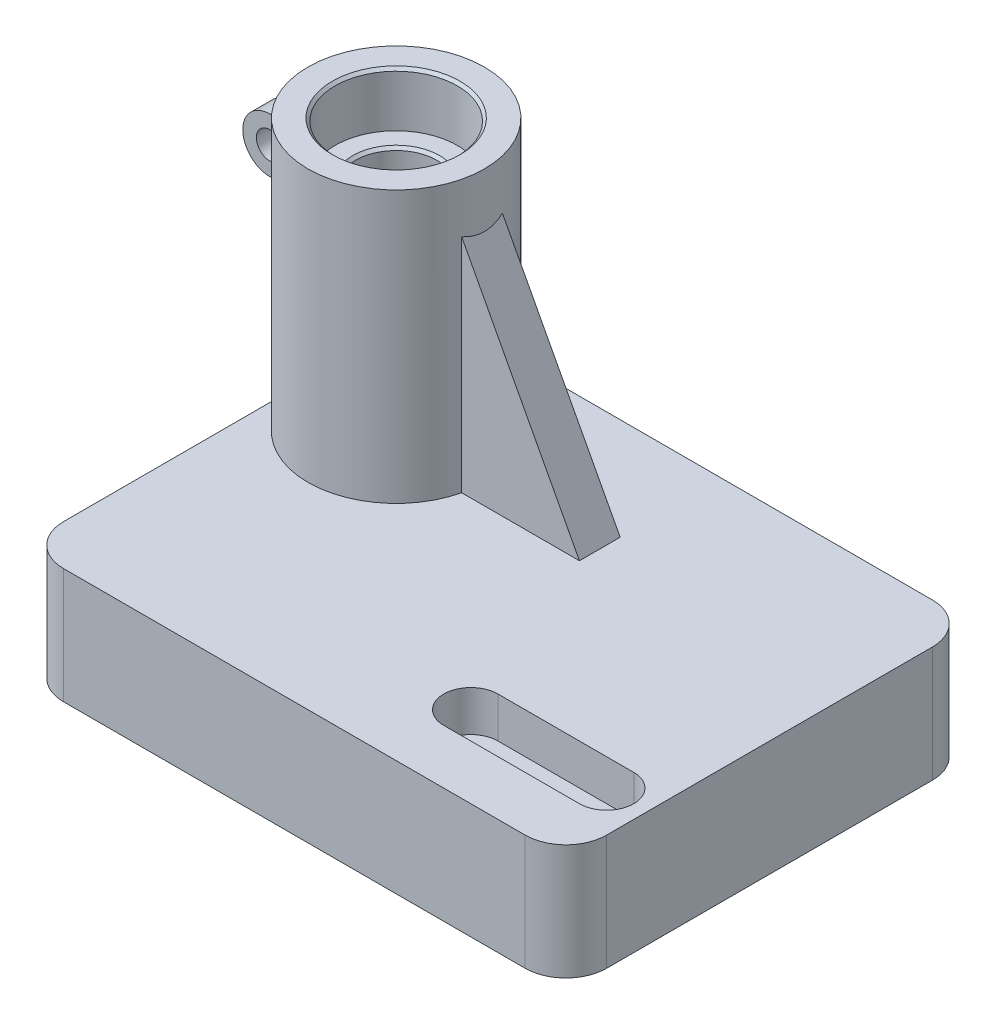
ISO-10303-21;
HEADER;
FILE_DESCRIPTION(('STEP AP214'),'2;1');
FILE_NAME('part.step','',(''),(''),'','','');
FILE_SCHEMA(('AUTOMOTIVE_DESIGN { 1 0 10303 214 1 1 1 1 }'));
ENDSEC;
DATA;
#1=APPLICATION_CONTEXT('core data for automotive mechanical design processes');
#2=APPLICATION_PROTOCOL_DEFINITION('international standard','automotive_design',2000,#1);
#3=PRODUCT_CONTEXT('',#1,'mechanical');
#4=PRODUCT('Part','Part','',(#3));
#5=PRODUCT_RELATED_PRODUCT_CATEGORY('part','',(#4));
#6=PRODUCT_DEFINITION_FORMATION('','',#4);
#7=PRODUCT_DEFINITION_CONTEXT('part definition',#1,'design');
#8=PRODUCT_DEFINITION('design','',#6,#7);
#9=PRODUCT_DEFINITION_SHAPE('','',#8);
#10=(LENGTH_UNIT() NAMED_UNIT(*) SI_UNIT(.MILLI.,.METRE.));
#11=(NAMED_UNIT(*) PLANE_ANGLE_UNIT() SI_UNIT($,.RADIAN.));
#12=(NAMED_UNIT(*) SI_UNIT($,.STERADIAN.) SOLID_ANGLE_UNIT());
#13=UNCERTAINTY_MEASURE_WITH_UNIT(LENGTH_MEASURE(1.E-05),#10,'distance_accuracy_value','');
#14=(GEOMETRIC_REPRESENTATION_CONTEXT(3) GLOBAL_UNCERTAINTY_ASSIGNED_CONTEXT((#13)) GLOBAL_UNIT_ASSIGNED_CONTEXT((#10,
#11,#12)) REPRESENTATION_CONTEXT('',''));
#15=CARTESIAN_POINT('',(0.,0.,0.));
#16=DIRECTION('',(0.,0.,1.));
#17=DIRECTION('',(1.,0.,0.));
#18=AXIS2_PLACEMENT_3D('',#15,#16,#17);
#19=CARTESIAN_POINT('',(-135.,0.,-60.));
#20=DIRECTION('',(0.,1.,0.));
#21=DIRECTION('',(0.,0.,1.));
#22=AXIS2_PLACEMENT_3D('',#19,#20,#21);
#23=CYLINDRICAL_SURFACE('',#22,30.);
#24=CARTESIAN_POINT('',(-135.,42.,-60.));
#25=DIRECTION('',(0.,1.,0.));
#26=DIRECTION('',(0.,0.,1.));
#27=AXIS2_PLACEMENT_3D('',#24,#25,#26);
#28=CIRCLE('',#27,30.);
#29=CARTESIAN_POINT('',(-135.,42.,-30.));
#30=VERTEX_POINT('',#29);
#31=EDGE_CURVE('E345',#30,#30,#28,.F.);
#32=ORIENTED_EDGE('',*,*,#31,.T.);
#33=EDGE_LOOP('',(#32));
#34=FACE_BOUND('',#33,.T.);
#35=CARTESIAN_POINT('',(-135.,243.,-60.));
#36=DIRECTION('',(0.,1.,0.));
#37=DIRECTION('',(0.,0.,1.));
#38=AXIS2_PLACEMENT_3D('',#35,#36,#37);
#39=CIRCLE('',#38,30.);
#40=CARTESIAN_POINT('',(-135.,243.,-30.));
#41=VERTEX_POINT('',#40);
#42=EDGE_CURVE('E342',#41,#41,#39,.T.);
#43=ORIENTED_EDGE('',*,*,#42,.T.);
#44=EDGE_LOOP('',(#43));
#45=FACE_BOUND('',#44,.T.);
#46=ADVANCED_FACE('F39',(#34,#45),#23,.F.);
#47=CARTESIAN_POINT('',(200.,85.,-150.));
#48=DIRECTION('',(-1.,0.,0.));
#49=DIRECTION('',(0.,0.,1.));
#50=AXIS2_PLACEMENT_3D('',#47,#48,#49);
#51=PLANE('',#50);
#52=DIRECTION('',(0.,0.,-1.));
#53=VECTOR('',#52,1.);
#54=CARTESIAN_POINT('',(200.,0.,-150.));
#55=LINE('',#54,#53);
#56=CARTESIAN_POINT('',(200.,0.,120.));
#57=VERTEX_POINT('',#56);
#58=CARTESIAN_POINT('',(200.,0.,-120.));
#59=VERTEX_POINT('',#58);
#60=EDGE_CURVE('E273',#57,#59,#55,.T.);
#61=ORIENTED_EDGE('',*,*,#60,.T.);
#62=DIRECTION('',(0.,-1.,0.));
#63=VECTOR('',#62,1.);
#64=CARTESIAN_POINT('',(200.,85.,-120.));
#65=LINE('',#64,#63);
#66=CARTESIAN_POINT('',(200.,85.,-120.));
#67=VERTEX_POINT('',#66);
#68=EDGE_CURVE('E329',#59,#67,#65,.F.);
#69=ORIENTED_EDGE('',*,*,#68,.T.);
#70=DIRECTION('',(0.,0.,-1.));
#71=VECTOR('',#70,1.);
#72=CARTESIAN_POINT('',(200.,85.,-150.));
#73=LINE('',#72,#71);
#74=CARTESIAN_POINT('',(200.,85.,120.));
#75=VERTEX_POINT('',#74);
#76=EDGE_CURVE('E276',#75,#67,#73,.T.);
#77=ORIENTED_EDGE('',*,*,#76,.F.);
#78=DIRECTION('',(0.,-1.,0.));
#79=VECTOR('',#78,1.);
#80=CARTESIAN_POINT('',(200.,85.,120.));
#81=LINE('',#80,#79);
#82=EDGE_CURVE('E326',#75,#57,#81,.T.);
#83=ORIENTED_EDGE('',*,*,#82,.T.);
#84=EDGE_LOOP('',(#61,#69,#77,#83));
#85=FACE_BOUND('',#84,.T.);
#86=ADVANCED_FACE('F394',(#85),#51,.F.);
#87=CARTESIAN_POINT('',(-200.,85.,-150.));
#88=DIRECTION('',(0.,0.,1.));
#89=DIRECTION('',(1.,0.,0.));
#90=AXIS2_PLACEMENT_3D('',#87,#88,#89);
#91=PLANE('',#90);
#92=DIRECTION('',(-1.,0.,0.));
#93=VECTOR('',#92,1.);
#94=CARTESIAN_POINT('',(-200.,0.,-150.));
#95=LINE('',#94,#93);
#96=CARTESIAN_POINT('',(170.,0.,-150.));
#97=VERTEX_POINT('',#96);
#98=CARTESIAN_POINT('',(-170.,0.,-150.));
#99=VERTEX_POINT('',#98);
#100=EDGE_CURVE('E292',#97,#99,#95,.T.);
#101=ORIENTED_EDGE('',*,*,#100,.T.);
#102=DIRECTION('',(0.,-1.,0.));
#103=VECTOR('',#102,1.);
#104=CARTESIAN_POINT('',(-170.,85.,-150.));
#105=LINE('',#104,#103);
#106=CARTESIAN_POINT('',(-170.,85.,-150.));
#107=VERTEX_POINT('',#106);
#108=EDGE_CURVE('E316',#99,#107,#105,.F.);
#109=ORIENTED_EDGE('',*,*,#108,.T.);
#110=DIRECTION('',(-1.,0.,0.));
#111=VECTOR('',#110,1.);
#112=CARTESIAN_POINT('',(-200.,85.,-150.));
#113=LINE('',#112,#111);
#114=CARTESIAN_POINT('',(170.,85.,-150.));
#115=VERTEX_POINT('',#114);
#116=EDGE_CURVE('E279',#115,#107,#113,.T.);
#117=ORIENTED_EDGE('',*,*,#116,.F.);
#118=DIRECTION('',(0.,-1.,0.));
#119=VECTOR('',#118,1.);
#120=CARTESIAN_POINT('',(170.,85.,-150.));
#121=LINE('',#120,#119);
#122=EDGE_CURVE('E313',#115,#97,#121,.T.);
#123=ORIENTED_EDGE('',*,*,#122,.T.);
#124=EDGE_LOOP('',(#101,#109,#117,#123));
#125=FACE_BOUND('',#124,.T.);
#126=ADVANCED_FACE('F402',(#125),#91,.F.);
#127=CARTESIAN_POINT('',(-200.,85.,-150.));
#128=DIRECTION('',(1.,0.,0.));
#129=DIRECTION('',(0.,0.,-1.));
#130=AXIS2_PLACEMENT_3D('',#127,#128,#129);
#131=PLANE('',#130);
#132=DIRECTION('',(0.,-1.,0.));
#133=VECTOR('',#132,1.);
#134=CARTESIAN_POINT('',(-200.,85.,120.));
#135=LINE('',#134,#133);
#136=CARTESIAN_POINT('',(-200.,0.,120.));
#137=VERTEX_POINT('',#136);
#138=CARTESIAN_POINT('',(-200.,85.,120.));
#139=VERTEX_POINT('',#138);
#140=EDGE_CURVE('E289',#137,#139,#135,.F.);
#141=ORIENTED_EDGE('',*,*,#140,.T.);
#142=DIRECTION('',(0.,0.,1.));
#143=VECTOR('',#142,1.);
#144=CARTESIAN_POINT('',(-200.,85.,-150.));
#145=LINE('',#144,#143);
#146=CARTESIAN_POINT('',(-200.,85.,-60.));
#147=VERTEX_POINT('',#146);
#148=EDGE_CURVE('E283',#147,#139,#145,.T.);
#149=ORIENTED_EDGE('',*,*,#148,.F.);
#150=CARTESIAN_POINT('',(-200.,85.,-120.));
#151=VERTEX_POINT('',#150);
#152=EDGE_CURVE('E284',#151,#147,#145,.T.);
#153=ORIENTED_EDGE('',*,*,#152,.F.);
#154=DIRECTION('',(0.,-1.,0.));
#155=VECTOR('',#154,1.);
#156=CARTESIAN_POINT('',(-200.,85.,-120.));
#157=LINE('',#156,#155);
#158=CARTESIAN_POINT('',(-200.,0.,-120.));
#159=VERTEX_POINT('',#158);
#160=EDGE_CURVE('E301',#151,#159,#157,.T.);
#161=ORIENTED_EDGE('',*,*,#160,.T.);
#162=DIRECTION('',(0.,0.,1.));
#163=VECTOR('',#162,1.);
#164=CARTESIAN_POINT('',(-200.,0.,-150.));
#165=LINE('',#164,#163);
#166=EDGE_CURVE('E295',#159,#137,#165,.T.);
#167=ORIENTED_EDGE('',*,*,#166,.T.);
#168=EDGE_LOOP('',(#141,#149,#153,#161,#167));
#169=FACE_BOUND('',#168,.T.);
#170=ADVANCED_FACE('F461',(#169),#131,.F.);
#171=CARTESIAN_POINT('',(-200.,85.,150.));
#172=DIRECTION('',(0.,0.,-1.));
#173=DIRECTION('',(-1.,0.,0.));
#174=AXIS2_PLACEMENT_3D('',#171,#172,#173);
#175=PLANE('',#174);
#176=DIRECTION('',(1.,0.,0.));
#177=VECTOR('',#176,1.);
#178=CARTESIAN_POINT('',(-200.,0.,150.));
#179=LINE('',#178,#177);
#180=CARTESIAN_POINT('',(-170.,0.,150.));
#181=VERTEX_POINT('',#180);
#182=CARTESIAN_POINT('',(170.,0.,150.));
#183=VERTEX_POINT('',#182);
#184=EDGE_CURVE('E280',#181,#183,#179,.T.);
#185=ORIENTED_EDGE('',*,*,#184,.T.);
#186=DIRECTION('',(0.,-1.,0.));
#187=VECTOR('',#186,1.);
#188=CARTESIAN_POINT('',(170.,85.,150.));
#189=LINE('',#188,#187);
#190=CARTESIAN_POINT('',(170.,85.,150.));
#191=VERTEX_POINT('',#190);
#192=EDGE_CURVE('E334',#183,#191,#189,.F.);
#193=ORIENTED_EDGE('',*,*,#192,.T.);
#194=DIRECTION('',(1.,0.,0.));
#195=VECTOR('',#194,1.);
#196=CARTESIAN_POINT('',(-200.,85.,150.));
#197=LINE('',#196,#195);
#198=CARTESIAN_POINT('',(-170.,85.,150.));
#199=VERTEX_POINT('',#198);
#200=EDGE_CURVE('E286',#199,#191,#197,.T.);
#201=ORIENTED_EDGE('',*,*,#200,.F.);
#202=DIRECTION('',(0.,-1.,0.));
#203=VECTOR('',#202,1.);
#204=CARTESIAN_POINT('',(-170.,85.,150.));
#205=LINE('',#204,#203);
#206=EDGE_CURVE('E331',#199,#181,#205,.T.);
#207=ORIENTED_EDGE('',*,*,#206,.T.);
#208=EDGE_LOOP('',(#185,#193,#201,#207));
#209=FACE_BOUND('',#208,.T.);
#210=ADVANCED_FACE('F454',(#209),#175,.F.);
#211=CARTESIAN_POINT('',(0.,85.,0.));
#212=DIRECTION('',(0.,1.,0.));
#213=DIRECTION('',(0.,0.,1.));
#214=AXIS2_PLACEMENT_3D('',#211,#212,#213);
#215=PLANE('',#214);
#216=ORIENTED_EDGE('',*,*,#152,.T.);
#217=CARTESIAN_POINT('',(-135.,85.,-60.));
#218=DIRECTION('',(0.,1.,0.));
#219=DIRECTION('',(0.,0.,1.));
#220=AXIS2_PLACEMENT_3D('',#217,#218,#219);
#221=CIRCLE('',#220,65.);
#222=CARTESIAN_POINT('',(-71.7544467966325,85.,-75.));
#223=VERTEX_POINT('',#222);
#224=EDGE_CURVE('E263',#223,#147,#221,.T.);
#225=ORIENTED_EDGE('',*,*,#224,.F.);
#226=DIRECTION('',(1.,0.,0.));
#227=VECTOR('',#226,1.);
#228=CARTESIAN_POINT('',(0.,85.,-75.));
#229=LINE('',#228,#227);
#230=CARTESIAN_POINT('',(14.9999999999999,85.,-75.));
#231=VERTEX_POINT('',#230);
#232=EDGE_CURVE('E223',#223,#231,#229,.T.);
#233=ORIENTED_EDGE('',*,*,#232,.T.);
#234=DIRECTION('',(0.,0.,-1.));
#235=VECTOR('',#234,1.);
#236=CARTESIAN_POINT('',(14.9999999999999,85.,0.));
#237=LINE('',#236,#235);
#238=CARTESIAN_POINT('',(14.9999999999999,85.,-45.));
#239=VERTEX_POINT('',#238);
#240=EDGE_CURVE('E234',#239,#231,#237,.T.);
#241=ORIENTED_EDGE('',*,*,#240,.F.);
#242=DIRECTION('',(1.,0.,0.));
#243=VECTOR('',#242,1.);
#244=CARTESIAN_POINT('',(0.,85.,-45.));
#245=LINE('',#244,#243);
#246=CARTESIAN_POINT('',(-71.7544467966325,85.,-45.));
#247=VERTEX_POINT('',#246);
#248=EDGE_CURVE('E228',#247,#239,#245,.T.);
#249=ORIENTED_EDGE('',*,*,#248,.F.);
#250=EDGE_CURVE('E274',#147,#247,#221,.T.);
#251=ORIENTED_EDGE('',*,*,#250,.F.);
#252=ORIENTED_EDGE('',*,*,#148,.T.);
#253=CARTESIAN_POINT('',(-170.,85.,120.));
#254=DIRECTION('',(0.,1.,0.));
#255=DIRECTION('',(0.,0.,1.));
#256=AXIS2_PLACEMENT_3D('',#253,#254,#255);
#257=CIRCLE('',#256,30.);
#258=EDGE_CURVE('E318',#139,#199,#257,.T.);
#259=ORIENTED_EDGE('',*,*,#258,.T.);
#260=ORIENTED_EDGE('',*,*,#200,.T.);
#261=CARTESIAN_POINT('',(170.,85.,120.));
#262=DIRECTION('',(0.,1.,0.));
#263=DIRECTION('',(0.,0.,1.));
#264=AXIS2_PLACEMENT_3D('',#261,#262,#263);
#265=CIRCLE('',#264,30.);
#266=EDGE_CURVE('E320',#191,#75,#265,.T.);
#267=ORIENTED_EDGE('',*,*,#266,.T.);
#268=ORIENTED_EDGE('',*,*,#76,.T.);
#269=CARTESIAN_POINT('',(170.,85.,-120.));
#270=DIRECTION('',(0.,1.,0.));
#271=DIRECTION('',(0.,0.,1.));
#272=AXIS2_PLACEMENT_3D('',#269,#270,#271);
#273=CIRCLE('',#272,30.);
#274=EDGE_CURVE('E322',#67,#115,#273,.T.);
#275=ORIENTED_EDGE('',*,*,#274,.T.);
#276=ORIENTED_EDGE('',*,*,#116,.T.);
#277=CARTESIAN_POINT('',(-170.,85.,-120.));
#278=DIRECTION('',(0.,1.,0.));
#279=DIRECTION('',(0.,0.,1.));
#280=AXIS2_PLACEMENT_3D('',#277,#278,#279);
#281=CIRCLE('',#280,30.);
#282=EDGE_CURVE('E324',#107,#151,#281,.T.);
#283=ORIENTED_EDGE('',*,*,#282,.T.);
#284=EDGE_LOOP('',(#216,#225,#233,#241,#249,#251,#252,#259,#260,#267,#268,#275,#276,#283));
#285=FACE_BOUND('',#284,.T.);
#286=CARTESIAN_POINT('',(70.,85.,90.));
#287=DIRECTION('',(0.,1.,0.));
#288=DIRECTION('',(0.,0.,1.));
#289=AXIS2_PLACEMENT_3D('',#286,#287,#288);
#290=CIRCLE('',#289,20.);
#291=CARTESIAN_POINT('',(70.,85.,70.));
#292=VERTEX_POINT('',#291);
#293=CARTESIAN_POINT('',(70.,85.,110.));
#294=VERTEX_POINT('',#293);
#295=EDGE_CURVE('E237',#292,#294,#290,.T.);
#296=ORIENTED_EDGE('',*,*,#295,.F.);
#297=DIRECTION('',(-1.,0.,0.));
#298=VECTOR('',#297,1.);
#299=CARTESIAN_POINT('',(70.,85.,70.));
#300=LINE('',#299,#298);
#301=CARTESIAN_POINT('',(170.,85.,70.));
#302=VERTEX_POINT('',#301);
#303=EDGE_CURVE('E242',#302,#292,#300,.T.);
#304=ORIENTED_EDGE('',*,*,#303,.F.);
#305=CARTESIAN_POINT('',(170.,85.,90.));
#306=DIRECTION('',(0.,1.,0.));
#307=DIRECTION('',(0.,0.,1.));
#308=AXIS2_PLACEMENT_3D('',#305,#306,#307);
#309=CIRCLE('',#308,20.);
#310=CARTESIAN_POINT('',(170.,85.,110.));
#311=VERTEX_POINT('',#310);
#312=EDGE_CURVE('E256',#311,#302,#309,.T.);
#313=ORIENTED_EDGE('',*,*,#312,.F.);
#314=DIRECTION('',(1.,0.,0.));
#315=VECTOR('',#314,1.);
#316=CARTESIAN_POINT('',(170.,85.,110.));
#317=LINE('',#316,#315);
#318=EDGE_CURVE('E253',#294,#311,#317,.T.);
#319=ORIENTED_EDGE('',*,*,#318,.F.);
#320=EDGE_LOOP('',(#296,#304,#313,#319));
#321=FACE_BOUND('',#320,.T.);
#322=ADVANCED_FACE('F451',(#285,#321),#215,.T.);
#323=CARTESIAN_POINT('',(0.,0.,0.));
#324=DIRECTION('',(0.,1.,0.));
#325=DIRECTION('',(0.,0.,1.));
#326=AXIS2_PLACEMENT_3D('',#323,#324,#325);
#327=PLANE('',#326);
#328=CARTESIAN_POINT('',(-135.,0.,-60.));
#329=DIRECTION('',(0.,1.,0.));
#330=DIRECTION('',(0.,0.,1.));
#331=AXIS2_PLACEMENT_3D('',#328,#329,#330);
#332=CIRCLE('',#331,46.9999999999999);
#333=CARTESIAN_POINT('',(-135.,0.,-13.));
#334=VERTEX_POINT('',#333);
#335=EDGE_CURVE('E336',#334,#334,#332,.T.);
#336=ORIENTED_EDGE('',*,*,#335,.T.);
#337=EDGE_LOOP('',(#336));
#338=FACE_BOUND('',#337,.T.);
#339=CARTESIAN_POINT('',(-170.,0.,120.));
#340=DIRECTION('',(0.,1.,0.));
#341=DIRECTION('',(0.,0.,1.));
#342=AXIS2_PLACEMENT_3D('',#339,#340,#341);
#343=CIRCLE('',#342,30.);
#344=EDGE_CURVE('E304',#181,#137,#343,.F.);
#345=ORIENTED_EDGE('',*,*,#344,.T.);
#346=ORIENTED_EDGE('',*,*,#166,.F.);
#347=CARTESIAN_POINT('',(-170.,0.,-120.));
#348=DIRECTION('',(0.,1.,0.));
#349=DIRECTION('',(0.,0.,1.));
#350=AXIS2_PLACEMENT_3D('',#347,#348,#349);
#351=CIRCLE('',#350,30.);
#352=EDGE_CURVE('E311',#159,#99,#351,.F.);
#353=ORIENTED_EDGE('',*,*,#352,.T.);
#354=ORIENTED_EDGE('',*,*,#100,.F.);
#355=CARTESIAN_POINT('',(170.,0.,-120.));
#356=DIRECTION('',(0.,1.,0.));
#357=DIRECTION('',(0.,0.,1.));
#358=AXIS2_PLACEMENT_3D('',#355,#356,#357);
#359=CIRCLE('',#358,30.);
#360=EDGE_CURVE('E309',#97,#59,#359,.F.);
#361=ORIENTED_EDGE('',*,*,#360,.T.);
#362=ORIENTED_EDGE('',*,*,#60,.F.);
#363=CARTESIAN_POINT('',(170.,0.,120.));
#364=DIRECTION('',(0.,1.,0.));
#365=DIRECTION('',(0.,0.,1.));
#366=AXIS2_PLACEMENT_3D('',#363,#364,#365);
#367=CIRCLE('',#366,30.);
#368=EDGE_CURVE('E307',#57,#183,#367,.F.);
#369=ORIENTED_EDGE('',*,*,#368,.T.);
#370=ORIENTED_EDGE('',*,*,#184,.F.);
#371=EDGE_LOOP('',(#345,#346,#353,#354,#361,#362,#369,#370));
#372=FACE_BOUND('',#371,.T.);
#373=ADVANCED_FACE('F450',(#338,#372),#327,.F.);
#374=CARTESIAN_POINT('',(-135.,285.,-60.));
#375=DIRECTION('',(0.,-1.,0.));
#376=DIRECTION('',(0.,0.,-1.));
#377=AXIS2_PLACEMENT_3D('',#374,#375,#376);
#378=CYLINDRICAL_SURFACE('',#377,65.);
#379=DIRECTION('',(0.,-1.,0.));
#380=VECTOR('',#379,1.);
#381=CARTESIAN_POINT('',(-199.505813691481,285.,-67.9999999999999));
#382=LINE('',#381,#380);
#383=CARTESIAN_POINT('',(-199.505813691481,249.,-67.9999999999999));
#384=VERTEX_POINT('',#383);
#385=CARTESIAN_POINT('',(-199.505813691481,209.,-67.9999999999999));
#386=VERTEX_POINT('',#385);
#387=EDGE_CURVE('E202',#384,#386,#382,.T.);
#388=ORIENTED_EDGE('',*,*,#387,.F.);
#389=CARTESIAN_POINT('',(-135.,249.,-60.));
#390=DIRECTION('',(0.,1.,0.));
#391=DIRECTION('',(0.,0.,1.));
#392=AXIS2_PLACEMENT_3D('',#389,#390,#391);
#393=CIRCLE('',#392,65.);
#394=CARTESIAN_POINT('',(-199.505813691481,249.,-52.));
#395=VERTEX_POINT('',#394);
#396=EDGE_CURVE('E189',#395,#384,#393,.F.);
#397=ORIENTED_EDGE('',*,*,#396,.F.);
#398=DIRECTION('',(0.,-1.,0.));
#399=VECTOR('',#398,1.);
#400=CARTESIAN_POINT('',(-199.505813691481,285.,-52.));
#401=LINE('',#400,#399);
#402=CARTESIAN_POINT('',(-199.505813691481,209.,-51.9999999999999));
#403=VERTEX_POINT('',#402);
#404=EDGE_CURVE('E179',#403,#395,#401,.F.);
#405=ORIENTED_EDGE('',*,*,#404,.F.);
#406=CARTESIAN_POINT('',(-135.,209.,-60.));
#407=DIRECTION('',(0.,-1.,0.));
#408=DIRECTION('',(0.,0.,-1.));
#409=AXIS2_PLACEMENT_3D('',#406,#407,#408);
#410=CIRCLE('',#409,65.);
#411=EDGE_CURVE('E196',#386,#403,#410,.F.);
#412=ORIENTED_EDGE('',*,*,#411,.F.);
#413=EDGE_LOOP('',(#388,#397,#405,#412));
#414=FACE_BOUND('',#413,.T.);
#415=ORIENTED_EDGE('',*,*,#250,.T.);
#416=DIRECTION('',(0.,-1.,0.));
#417=VECTOR('',#416,1.);
#418=CARTESIAN_POINT('',(-71.7544467966325,285.,-45.));
#419=LINE('',#418,#417);
#420=CARTESIAN_POINT('',(-71.7544467966325,248.302488087779,-45.));
#421=VERTEX_POINT('',#420);
#422=EDGE_CURVE('E225',#247,#421,#419,.F.);
#423=ORIENTED_EDGE('',*,*,#422,.T.);
#424=CARTESIAN_POINT('',(-135.,367.352941176471,-60.));
#425=DIRECTION('',(0.883115719457411,0.469155225961749,0.));
#426=DIRECTION('',(0.469155225961749,-0.883115719457411,0.));
#427=AXIS2_PLACEMENT_3D('',#424,#425,#426);
#428=ELLIPSE('',#427,138.546895362303,65.);
#429=CARTESIAN_POINT('',(-71.7544467966325,248.302488087779,-75.));
#430=VERTEX_POINT('',#429);
#431=EDGE_CURVE('E231',#421,#430,#428,.T.);
#432=ORIENTED_EDGE('',*,*,#431,.T.);
#433=DIRECTION('',(0.,-1.,0.));
#434=VECTOR('',#433,1.);
#435=CARTESIAN_POINT('',(-71.7544467966325,285.,-75.));
#436=LINE('',#435,#434);
#437=EDGE_CURVE('E220',#223,#430,#436,.F.);
#438=ORIENTED_EDGE('',*,*,#437,.F.);
#439=ORIENTED_EDGE('',*,*,#224,.T.);
#440=EDGE_LOOP('',(#415,#423,#432,#438,#439));
#441=FACE_BOUND('',#440,.T.);
#442=CARTESIAN_POINT('',(-135.,285.,-60.));
#443=DIRECTION('',(0.,1.,0.));
#444=DIRECTION('',(0.,0.,1.));
#445=AXIS2_PLACEMENT_3D('',#442,#443,#444);
#446=CIRCLE('',#445,65.);
#447=CARTESIAN_POINT('',(-135.,285.,5.00000000000005));
#448=VERTEX_POINT('',#447);
#449=EDGE_CURVE('E270',#448,#448,#446,.T.);
#450=ORIENTED_EDGE('',*,*,#449,.F.);
#451=EDGE_LOOP('',(#450));
#452=FACE_BOUND('',#451,.T.);
#453=ADVANCED_FACE('F199',(#414,#441,#452),#378,.T.);
#454=CARTESIAN_POINT('',(-135.,285.,-60.));
#455=DIRECTION('',(0.,1.,0.));
#456=DIRECTION('',(0.,0.,1.));
#457=AXIS2_PLACEMENT_3D('',#454,#455,#456);
#458=PLANE('',#457);
#459=CARTESIAN_POINT('',(-135.,285.,-60.));
#460=DIRECTION('',(0.,1.,0.));
#461=DIRECTION('',(0.,0.,1.));
#462=AXIS2_PLACEMENT_3D('',#459,#460,#461);
#463=CIRCLE('',#462,47.0000000000001);
#464=CARTESIAN_POINT('',(-135.,285.,-12.9999999999999));
#465=VERTEX_POINT('',#464);
#466=EDGE_CURVE('E357',#465,#465,#463,.F.);
#467=ORIENTED_EDGE('',*,*,#466,.T.);
#468=EDGE_LOOP('',(#467));
#469=FACE_BOUND('',#468,.T.);
#470=ORIENTED_EDGE('',*,*,#449,.T.);
#471=EDGE_LOOP('',(#470));
#472=FACE_BOUND('',#471,.T.);
#473=ADVANCED_FACE('F443',(#469,#472),#458,.T.);
#474=CARTESIAN_POINT('',(-170.,85.,-120.));
#475=DIRECTION('',(0.,-1.,0.));
#476=DIRECTION('',(0.,0.,-1.));
#477=AXIS2_PLACEMENT_3D('',#474,#475,#476);
#478=CYLINDRICAL_SURFACE('',#477,30.);
#479=ORIENTED_EDGE('',*,*,#282,.F.);
#480=ORIENTED_EDGE('',*,*,#108,.F.);
#481=ORIENTED_EDGE('',*,*,#352,.F.);
#482=ORIENTED_EDGE('',*,*,#160,.F.);
#483=EDGE_LOOP('',(#479,#480,#481,#482));
#484=FACE_BOUND('',#483,.T.);
#485=ADVANCED_FACE('F446',(#484),#478,.T.);
#486=CARTESIAN_POINT('',(170.,85.,-120.));
#487=DIRECTION('',(0.,-1.,0.));
#488=DIRECTION('',(0.,0.,-1.));
#489=AXIS2_PLACEMENT_3D('',#486,#487,#488);
#490=CYLINDRICAL_SURFACE('',#489,30.);
#491=ORIENTED_EDGE('',*,*,#274,.F.);
#492=ORIENTED_EDGE('',*,*,#68,.F.);
#493=ORIENTED_EDGE('',*,*,#360,.F.);
#494=ORIENTED_EDGE('',*,*,#122,.F.);
#495=EDGE_LOOP('',(#491,#492,#493,#494));
#496=FACE_BOUND('',#495,.T.);
#497=ADVANCED_FACE('F471',(#496),#490,.T.);
#498=CARTESIAN_POINT('',(170.,85.,120.));
#499=DIRECTION('',(0.,-1.,0.));
#500=DIRECTION('',(0.,0.,-1.));
#501=AXIS2_PLACEMENT_3D('',#498,#499,#500);
#502=CYLINDRICAL_SURFACE('',#501,30.);
#503=ORIENTED_EDGE('',*,*,#266,.F.);
#504=ORIENTED_EDGE('',*,*,#192,.F.);
#505=ORIENTED_EDGE('',*,*,#368,.F.);
#506=ORIENTED_EDGE('',*,*,#82,.F.);
#507=EDGE_LOOP('',(#503,#504,#505,#506));
#508=FACE_BOUND('',#507,.T.);
#509=ADVANCED_FACE('F475',(#508),#502,.T.);
#510=CARTESIAN_POINT('',(-170.,85.,120.));
#511=DIRECTION('',(0.,-1.,0.));
#512=DIRECTION('',(0.,0.,-1.));
#513=AXIS2_PLACEMENT_3D('',#510,#511,#512);
#514=CYLINDRICAL_SURFACE('',#513,30.);
#515=ORIENTED_EDGE('',*,*,#258,.F.);
#516=ORIENTED_EDGE('',*,*,#140,.F.);
#517=ORIENTED_EDGE('',*,*,#344,.F.);
#518=ORIENTED_EDGE('',*,*,#206,.F.);
#519=EDGE_LOOP('',(#515,#516,#517,#518));
#520=FACE_BOUND('',#519,.T.);
#521=ADVANCED_FACE('F441',(#520),#514,.T.);
#522=CARTESIAN_POINT('',(70.,55.,90.));
#523=DIRECTION('',(0.,1.,0.));
#524=DIRECTION('',(0.,0.,1.));
#525=AXIS2_PLACEMENT_3D('',#522,#523,#524);
#526=CYLINDRICAL_SURFACE('',#525,20.);
#527=ORIENTED_EDGE('',*,*,#295,.T.);
#528=DIRECTION('',(0.,1.,0.));
#529=VECTOR('',#528,1.);
#530=CARTESIAN_POINT('',(70.,55.,110.));
#531=LINE('',#530,#529);
#532=CARTESIAN_POINT('',(70.,55.,110.));
#533=VERTEX_POINT('',#532);
#534=EDGE_CURVE('E251',#533,#294,#531,.T.);
#535=ORIENTED_EDGE('',*,*,#534,.F.);
#536=CARTESIAN_POINT('',(70.,55.,90.));
#537=DIRECTION('',(0.,1.,0.));
#538=DIRECTION('',(0.,0.,1.));
#539=AXIS2_PLACEMENT_3D('',#536,#537,#538);
#540=CIRCLE('',#539,20.);
#541=CARTESIAN_POINT('',(70.,55.,70.));
#542=VERTEX_POINT('',#541);
#543=EDGE_CURVE('E238',#542,#533,#540,.T.);
#544=ORIENTED_EDGE('',*,*,#543,.F.);
#545=DIRECTION('',(0.,1.,0.));
#546=VECTOR('',#545,1.);
#547=CARTESIAN_POINT('',(70.,55.,70.));
#548=LINE('',#547,#546);
#549=EDGE_CURVE('E261',#542,#292,#548,.T.);
#550=ORIENTED_EDGE('',*,*,#549,.T.);
#551=EDGE_LOOP('',(#527,#535,#544,#550));
#552=FACE_BOUND('',#551,.T.);
#553=ADVANCED_FACE('F431',(#552),#526,.F.);
#554=CARTESIAN_POINT('',(70.,55.,70.));
#555=DIRECTION('',(0.,0.,-1.));
#556=DIRECTION('',(-1.,0.,0.));
#557=AXIS2_PLACEMENT_3D('',#554,#555,#556);
#558=PLANE('',#557);
#559=ORIENTED_EDGE('',*,*,#303,.T.);
#560=ORIENTED_EDGE('',*,*,#549,.F.);
#561=DIRECTION('',(-1.,0.,0.));
#562=VECTOR('',#561,1.);
#563=CARTESIAN_POINT('',(70.,55.,70.));
#564=LINE('',#563,#562);
#565=CARTESIAN_POINT('',(170.,55.,70.));
#566=VERTEX_POINT('',#565);
#567=EDGE_CURVE('E248',#566,#542,#564,.T.);
#568=ORIENTED_EDGE('',*,*,#567,.F.);
#569=DIRECTION('',(0.,1.,0.));
#570=VECTOR('',#569,1.);
#571=CARTESIAN_POINT('',(170.,55.,70.));
#572=LINE('',#571,#570);
#573=EDGE_CURVE('E264',#566,#302,#572,.T.);
#574=ORIENTED_EDGE('',*,*,#573,.T.);
#575=EDGE_LOOP('',(#559,#560,#568,#574));
#576=FACE_BOUND('',#575,.T.);
#577=ADVANCED_FACE('F427',(#576),#558,.F.);
#578=CARTESIAN_POINT('',(170.,55.,90.));
#579=DIRECTION('',(0.,1.,0.));
#580=DIRECTION('',(0.,0.,1.));
#581=AXIS2_PLACEMENT_3D('',#578,#579,#580);
#582=CYLINDRICAL_SURFACE('',#581,20.);
#583=ORIENTED_EDGE('',*,*,#312,.T.);
#584=ORIENTED_EDGE('',*,*,#573,.F.);
#585=CARTESIAN_POINT('',(170.,55.,90.));
#586=DIRECTION('',(0.,1.,0.));
#587=DIRECTION('',(0.,0.,1.));
#588=AXIS2_PLACEMENT_3D('',#585,#586,#587);
#589=CIRCLE('',#588,20.);
#590=CARTESIAN_POINT('',(170.,55.,110.));
#591=VERTEX_POINT('',#590);
#592=EDGE_CURVE('E245',#591,#566,#589,.T.);
#593=ORIENTED_EDGE('',*,*,#592,.F.);
#594=DIRECTION('',(0.,1.,0.));
#595=VECTOR('',#594,1.);
#596=CARTESIAN_POINT('',(170.,55.,110.));
#597=LINE('',#596,#595);
#598=EDGE_CURVE('E266',#591,#311,#597,.T.);
#599=ORIENTED_EDGE('',*,*,#598,.T.);
#600=EDGE_LOOP('',(#583,#584,#593,#599));
#601=FACE_BOUND('',#600,.T.);
#602=ADVANCED_FACE('F430',(#601),#582,.F.);
#603=CARTESIAN_POINT('',(170.,55.,110.));
#604=DIRECTION('',(0.,0.,1.));
#605=DIRECTION('',(1.,0.,0.));
#606=AXIS2_PLACEMENT_3D('',#603,#604,#605);
#607=PLANE('',#606);
#608=ORIENTED_EDGE('',*,*,#318,.T.);
#609=ORIENTED_EDGE('',*,*,#598,.F.);
#610=DIRECTION('',(1.,0.,0.));
#611=VECTOR('',#610,1.);
#612=CARTESIAN_POINT('',(170.,55.,110.));
#613=LINE('',#612,#611);
#614=EDGE_CURVE('E241',#533,#591,#613,.T.);
#615=ORIENTED_EDGE('',*,*,#614,.F.);
#616=ORIENTED_EDGE('',*,*,#534,.T.);
#617=EDGE_LOOP('',(#608,#609,#615,#616));
#618=FACE_BOUND('',#617,.T.);
#619=ADVANCED_FACE('F425',(#618),#607,.F.);
#620=CARTESIAN_POINT('',(70.,55.,90.));
#621=DIRECTION('',(0.,1.,0.));
#622=DIRECTION('',(0.,0.,1.));
#623=AXIS2_PLACEMENT_3D('',#620,#621,#622);
#624=PLANE('',#623);
#625=ORIENTED_EDGE('',*,*,#543,.T.);
#626=ORIENTED_EDGE('',*,*,#614,.T.);
#627=ORIENTED_EDGE('',*,*,#592,.T.);
#628=ORIENTED_EDGE('',*,*,#567,.T.);
#629=EDGE_LOOP('',(#625,#626,#627,#628));
#630=FACE_BOUND('',#629,.T.);
#631=ADVANCED_FACE('F421',(#630),#624,.T.);
#632=CARTESIAN_POINT('',(14.9999999999999,85.,-60.));
#633=DIRECTION('',(0.883115719457411,0.469155225961749,0.));
#634=DIRECTION('',(-0.469155225961749,0.883115719457411,0.));
#635=AXIS2_PLACEMENT_3D('',#632,#633,#634);
#636=PLANE('',#635);
#637=DIRECTION('',(-0.469155225961749,0.883115719457411,0.));
#638=VECTOR('',#637,1.);
#639=CARTESIAN_POINT('',(14.9999999999999,85.,-45.));
#640=LINE('',#639,#638);
#641=EDGE_CURVE('E217',#239,#421,#640,.T.);
#642=ORIENTED_EDGE('',*,*,#641,.F.);
#643=ORIENTED_EDGE('',*,*,#240,.T.);
#644=DIRECTION('',(-0.469155225961749,0.883115719457411,0.));
#645=VECTOR('',#644,1.);
#646=CARTESIAN_POINT('',(14.9999999999999,85.,-75.));
#647=LINE('',#646,#645);
#648=EDGE_CURVE('E216',#231,#430,#647,.T.);
#649=ORIENTED_EDGE('',*,*,#648,.T.);
#650=ORIENTED_EDGE('',*,*,#431,.F.);
#651=EDGE_LOOP('',(#642,#643,#649,#650));
#652=FACE_BOUND('',#651,.T.);
#653=ADVANCED_FACE('F414',(#652),#636,.T.);
#654=CARTESIAN_POINT('',(0.,142.5,-45.));
#655=DIRECTION('',(0.,0.,1.));
#656=DIRECTION('',(1.,0.,0.));
#657=AXIS2_PLACEMENT_3D('',#654,#655,#656);
#658=PLANE('',#657);
#659=ORIENTED_EDGE('',*,*,#422,.F.);
#660=ORIENTED_EDGE('',*,*,#248,.T.);
#661=ORIENTED_EDGE('',*,*,#641,.T.);
#662=EDGE_LOOP('',(#659,#660,#661));
#663=FACE_BOUND('',#662,.T.);
#664=ADVANCED_FACE('F410',(#663),#658,.T.);
#665=CARTESIAN_POINT('',(0.,142.5,-75.));
#666=DIRECTION('',(0.,0.,1.));
#667=DIRECTION('',(1.,0.,0.));
#668=AXIS2_PLACEMENT_3D('',#665,#666,#667);
#669=PLANE('',#668);
#670=ORIENTED_EDGE('',*,*,#232,.F.);
#671=ORIENTED_EDGE('',*,*,#437,.T.);
#672=ORIENTED_EDGE('',*,*,#648,.F.);
#673=EDGE_LOOP('',(#670,#671,#672));
#674=FACE_BOUND('',#673,.T.);
#675=ADVANCED_FACE('F413',(#674),#669,.F.);
#676=CARTESIAN_POINT('',(-135.,40.,-60.));
#677=DIRECTION('',(0.,1.,0.));
#678=DIRECTION('',(0.,0.,1.));
#679=AXIS2_PLACEMENT_3D('',#676,#677,#678);
#680=PLANE('',#679);
#681=CARTESIAN_POINT('',(-135.,40.,-60.));
#682=DIRECTION('',(0.,1.,0.));
#683=DIRECTION('',(0.,0.,1.));
#684=AXIS2_PLACEMENT_3D('',#681,#682,#683);
#685=CIRCLE('',#684,32.);
#686=CARTESIAN_POINT('',(-135.,40.,-27.9999999999999));
#687=VERTEX_POINT('',#686);
#688=EDGE_CURVE('E348',#687,#687,#685,.T.);
#689=ORIENTED_EDGE('',*,*,#688,.T.);
#690=EDGE_LOOP('',(#689));
#691=FACE_BOUND('',#690,.T.);
#692=CARTESIAN_POINT('',(-135.,40.,-60.));
#693=DIRECTION('',(0.,1.,0.));
#694=DIRECTION('',(0.,0.,1.));
#695=AXIS2_PLACEMENT_3D('',#692,#693,#694);
#696=CIRCLE('',#695,45.);
#697=CARTESIAN_POINT('',(-135.,40.,-15.));
#698=VERTEX_POINT('',#697);
#699=EDGE_CURVE('E213',#698,#698,#696,.T.);
#700=ORIENTED_EDGE('',*,*,#699,.F.);
#701=EDGE_LOOP('',(#700));
#702=FACE_BOUND('',#701,.T.);
#703=ADVANCED_FACE('F417',(#691,#702),#680,.F.);
#704=CARTESIAN_POINT('',(-135.,40.,-60.));
#705=DIRECTION('',(0.,-1.,0.));
#706=DIRECTION('',(0.,0.,-1.));
#707=AXIS2_PLACEMENT_3D('',#704,#705,#706);
#708=CYLINDRICAL_SURFACE('',#707,45.);
#709=CARTESIAN_POINT('',(-135.,1.99999999999996,-60.));
#710=DIRECTION('',(0.,1.,0.));
#711=DIRECTION('',(0.,0.,1.));
#712=AXIS2_PLACEMENT_3D('',#709,#710,#711);
#713=CIRCLE('',#712,45.);
#714=CARTESIAN_POINT('',(-135.,1.99999999999996,-15.));
#715=VERTEX_POINT('',#714);
#716=EDGE_CURVE('E339',#715,#715,#713,.F.);
#717=ORIENTED_EDGE('',*,*,#716,.T.);
#718=EDGE_LOOP('',(#717));
#719=FACE_BOUND('',#718,.T.);
#720=ORIENTED_EDGE('',*,*,#699,.T.);
#721=EDGE_LOOP('',(#720));
#722=FACE_BOUND('',#721,.T.);
#723=ADVANCED_FACE('F408',(#719,#722),#708,.F.);
#724=CARTESIAN_POINT('',(-135.,245.,-60.));
#725=DIRECTION('',(0.,1.,0.));
#726=DIRECTION('',(0.,0.,1.));
#727=AXIS2_PLACEMENT_3D('',#724,#725,#726);
#728=PLANE('',#727);
#729=CARTESIAN_POINT('',(-135.,245.,-60.));
#730=DIRECTION('',(0.,1.,0.));
#731=DIRECTION('',(0.,0.,1.));
#732=AXIS2_PLACEMENT_3D('',#729,#730,#731);
#733=CIRCLE('',#732,31.9999999999999);
#734=CARTESIAN_POINT('',(-135.,245.,-28.0000000000001));
#735=VERTEX_POINT('',#734);
#736=EDGE_CURVE('E351',#735,#735,#733,.F.);
#737=ORIENTED_EDGE('',*,*,#736,.T.);
#738=EDGE_LOOP('',(#737));
#739=FACE_BOUND('',#738,.T.);
#740=CARTESIAN_POINT('',(-135.,245.,-60.));
#741=DIRECTION('',(0.,1.,0.));
#742=DIRECTION('',(0.,0.,1.));
#743=AXIS2_PLACEMENT_3D('',#740,#741,#742);
#744=CIRCLE('',#743,45.);
#745=CARTESIAN_POINT('',(-135.,245.,-15.));
#746=VERTEX_POINT('',#745);
#747=EDGE_CURVE('E207',#746,#746,#744,.T.);
#748=ORIENTED_EDGE('',*,*,#747,.T.);
#749=EDGE_LOOP('',(#748));
#750=FACE_BOUND('',#749,.T.);
#751=ADVANCED_FACE('F525',(#739,#750),#728,.T.);
#752=CARTESIAN_POINT('',(-135.,245.,-60.));
#753=DIRECTION('',(0.,1.,0.));
#754=DIRECTION('',(0.,0.,1.));
#755=AXIS2_PLACEMENT_3D('',#752,#753,#754);
#756=CYLINDRICAL_SURFACE('',#755,45.);
#757=CARTESIAN_POINT('',(-135.,283.,-60.));
#758=DIRECTION('',(0.,1.,0.));
#759=DIRECTION('',(0.,0.,1.));
#760=AXIS2_PLACEMENT_3D('',#757,#758,#759);
#761=CIRCLE('',#760,45.);
#762=CARTESIAN_POINT('',(-135.,283.,-15.));
#763=VERTEX_POINT('',#762);
#764=EDGE_CURVE('E354',#763,#763,#761,.T.);
#765=ORIENTED_EDGE('',*,*,#764,.T.);
#766=EDGE_LOOP('',(#765));
#767=FACE_BOUND('',#766,.T.);
#768=ORIENTED_EDGE('',*,*,#747,.F.);
#769=EDGE_LOOP('',(#768));
#770=FACE_BOUND('',#769,.T.);
#771=ADVANCED_FACE('F491',(#767,#770),#756,.F.);
#772=CARTESIAN_POINT('',(-135.,0.,-60.));
#773=DIRECTION('',(0.,-1.,0.));
#774=DIRECTION('',(0.,0.,-1.));
#775=AXIS2_PLACEMENT_3D('',#772,#773,#774);
#776=CONICAL_SURFACE('',#775,46.9999999999999,0.785398163397441);
#777=ORIENTED_EDGE('',*,*,#716,.F.);
#778=EDGE_LOOP('',(#777));
#779=FACE_BOUND('',#778,.T.);
#780=ORIENTED_EDGE('',*,*,#335,.F.);
#781=EDGE_LOOP('',(#780));
#782=FACE_BOUND('',#781,.T.);
#783=ADVANCED_FACE('F484',(#779,#782),#776,.F.);
#784=CARTESIAN_POINT('',(-135.,42.,-60.));
#785=DIRECTION('',(0.,-1.,0.));
#786=DIRECTION('',(0.,0.,-1.));
#787=AXIS2_PLACEMENT_3D('',#784,#785,#786);
#788=CONICAL_SURFACE('',#787,30.,0.785398163397449);
#789=ORIENTED_EDGE('',*,*,#688,.F.);
#790=EDGE_LOOP('',(#789));
#791=FACE_BOUND('',#790,.T.);
#792=ORIENTED_EDGE('',*,*,#31,.F.);
#793=EDGE_LOOP('',(#792));
#794=FACE_BOUND('',#793,.T.);
#795=ADVANCED_FACE('F490',(#791,#794),#788,.F.);
#796=CARTESIAN_POINT('',(-135.,245.,-60.));
#797=DIRECTION('',(0.,1.,0.));
#798=DIRECTION('',(0.,0.,1.));
#799=AXIS2_PLACEMENT_3D('',#796,#797,#798);
#800=CONICAL_SURFACE('',#799,31.9999999999999,0.785398163397442);
#801=ORIENTED_EDGE('',*,*,#42,.F.);
#802=EDGE_LOOP('',(#801));
#803=FACE_BOUND('',#802,.T.);
#804=ORIENTED_EDGE('',*,*,#736,.F.);
#805=EDGE_LOOP('',(#804));
#806=FACE_BOUND('',#805,.T.);
#807=ADVANCED_FACE('F498',(#803,#806),#800,.F.);
#808=CARTESIAN_POINT('',(-135.,283.,-60.));
#809=DIRECTION('',(0.,1.,0.));
#810=DIRECTION('',(0.,0.,1.));
#811=AXIS2_PLACEMENT_3D('',#808,#809,#810);
#812=CONICAL_SURFACE('',#811,45.,0.785398163397445);
#813=ORIENTED_EDGE('',*,*,#466,.F.);
#814=EDGE_LOOP('',(#813));
#815=FACE_BOUND('',#814,.T.);
#816=ORIENTED_EDGE('',*,*,#764,.F.);
#817=EDGE_LOOP('',(#816));
#818=FACE_BOUND('',#817,.T.);
#819=ADVANCED_FACE('F504',(#815,#818),#812,.F.);
#820=CARTESIAN_POINT('',(200.002,249.,-68.));
#821=DIRECTION('',(0.,1.,0.));
#822=DIRECTION('',(0.,0.,1.));
#823=AXIS2_PLACEMENT_3D('',#820,#821,#822);
#824=PLANE('',#823);
#825=DIRECTION('',(-1.,0.,0.));
#826=VECTOR('',#825,1.);
#827=CARTESIAN_POINT('',(200.002,249.,-68.));
#828=LINE('',#827,#826);
#829=CARTESIAN_POINT('',(-220.,249.,-67.9999999999999));
#830=VERTEX_POINT('',#829);
#831=EDGE_CURVE('E195',#384,#830,#828,.T.);
#832=ORIENTED_EDGE('',*,*,#831,.T.);
#833=DIRECTION('',(0.,0.,-1.));
#834=VECTOR('',#833,1.);
#835=CARTESIAN_POINT('',(-220.,249.,-68.));
#836=LINE('',#835,#834);
#837=CARTESIAN_POINT('',(-220.,249.,-52.));
#838=VERTEX_POINT('',#837);
#839=EDGE_CURVE('E11',#830,#838,#836,.F.);
#840=ORIENTED_EDGE('',*,*,#839,.T.);
#841=DIRECTION('',(-1.,0.,0.));
#842=VECTOR('',#841,1.);
#843=CARTESIAN_POINT('',(200.002,249.,-52.));
#844=LINE('',#843,#842);
#845=EDGE_CURVE('E182',#395,#838,#844,.T.);
#846=ORIENTED_EDGE('',*,*,#845,.F.);
#847=ORIENTED_EDGE('',*,*,#396,.T.);
#848=EDGE_LOOP('',(#832,#840,#846,#847));
#849=FACE_BOUND('',#848,.T.);
#850=ADVANCED_FACE('F193',(#849),#824,.T.);
#851=CARTESIAN_POINT('',(200.002,249.,-52.));
#852=DIRECTION('',(0.,0.,1.));
#853=DIRECTION('',(0.,-1.,0.));
#854=AXIS2_PLACEMENT_3D('',#851,#852,#853);
#855=PLANE('',#854);
#856=CARTESIAN_POINT('',(-220.,229.,-52.));
#857=DIRECTION('',(0.,0.,1.));
#858=DIRECTION('',(0.,-1.,0.));
#859=AXIS2_PLACEMENT_3D('',#856,#857,#858);
#860=CIRCLE('',#859,10.);
#861=CARTESIAN_POINT('',(-220.,219.,-51.9999999999999));
#862=VERTEX_POINT('',#861);
#863=EDGE_CURVE('E369',#862,#862,#860,.T.);
#864=ORIENTED_EDGE('',*,*,#863,.F.);
#865=EDGE_LOOP('',(#864));
#866=FACE_BOUND('',#865,.T.);
#867=CARTESIAN_POINT('',(-220.,229.,-52.));
#868=DIRECTION('',(0.,0.,1.));
#869=DIRECTION('',(0.,-1.,0.));
#870=AXIS2_PLACEMENT_3D('',#867,#868,#869);
#871=CIRCLE('',#870,20.);
#872=CARTESIAN_POINT('',(-240.,229.,-51.9999999999999));
#873=VERTEX_POINT('',#872);
#874=EDGE_CURVE('E360',#838,#873,#871,.T.);
#875=ORIENTED_EDGE('',*,*,#874,.T.);
#876=CARTESIAN_POINT('',(-220.,229.,-52.));
#877=DIRECTION('',(0.,0.,1.));
#878=DIRECTION('',(0.,-1.,0.));
#879=AXIS2_PLACEMENT_3D('',#876,#877,#878);
#880=CIRCLE('',#879,20.);
#881=CARTESIAN_POINT('',(-220.,209.,-51.9999999999999));
#882=VERTEX_POINT('',#881);
#883=EDGE_CURVE('E362',#873,#882,#880,.T.);
#884=ORIENTED_EDGE('',*,*,#883,.T.);
#885=DIRECTION('',(-1.,0.,0.));
#886=VECTOR('',#885,1.);
#887=CARTESIAN_POINT('',(200.002,209.,-52.));
#888=LINE('',#887,#886);
#889=EDGE_CURVE('E185',#403,#882,#888,.T.);
#890=ORIENTED_EDGE('',*,*,#889,.F.);
#891=ORIENTED_EDGE('',*,*,#404,.T.);
#892=ORIENTED_EDGE('',*,*,#845,.T.);
#893=EDGE_LOOP('',(#875,#884,#890,#891,#892));
#894=FACE_BOUND('',#893,.T.);
#895=ADVANCED_FACE('F181',(#866,#894),#855,.T.);
#896=CARTESIAN_POINT('',(200.002,249.,-68.));
#897=DIRECTION('',(0.,0.,-1.));
#898=DIRECTION('',(-1.,0.,0.));
#899=AXIS2_PLACEMENT_3D('',#896,#897,#898);
#900=PLANE('',#899);
#901=CARTESIAN_POINT('',(-220.,229.,-67.9999999999999));
#902=DIRECTION('',(0.,0.,-1.));
#903=DIRECTION('',(-1.,0.,0.));
#904=AXIS2_PLACEMENT_3D('',#901,#902,#903);
#905=CIRCLE('',#904,10.);
#906=CARTESIAN_POINT('',(-230.,229.,-67.9999999999999));
#907=VERTEX_POINT('',#906);
#908=EDGE_CURVE('E43',#907,#907,#905,.T.);
#909=ORIENTED_EDGE('',*,*,#908,.F.);
#910=EDGE_LOOP('',(#909));
#911=FACE_BOUND('',#910,.T.);
#912=DIRECTION('',(-1.,0.,0.));
#913=VECTOR('',#912,1.);
#914=CARTESIAN_POINT('',(200.002,209.,-68.));
#915=LINE('',#914,#913);
#916=CARTESIAN_POINT('',(-220.,209.,-67.9999999999999));
#917=VERTEX_POINT('',#916);
#918=EDGE_CURVE('E208',#386,#917,#915,.T.);
#919=ORIENTED_EDGE('',*,*,#918,.T.);
#920=CARTESIAN_POINT('',(-220.,229.,-67.9999999999999));
#921=DIRECTION('',(0.,0.,-1.));
#922=DIRECTION('',(-1.,0.,0.));
#923=AXIS2_PLACEMENT_3D('',#920,#921,#922);
#924=CIRCLE('',#923,20.);
#925=CARTESIAN_POINT('',(-240.,229.,-67.9999999999999));
#926=VERTEX_POINT('',#925);
#927=EDGE_CURVE('E48',#917,#926,#924,.T.);
#928=ORIENTED_EDGE('',*,*,#927,.T.);
#929=CARTESIAN_POINT('',(-220.,229.,-67.9999999999999));
#930=DIRECTION('',(0.,0.,-1.));
#931=DIRECTION('',(-1.,0.,0.));
#932=AXIS2_PLACEMENT_3D('',#929,#930,#931);
#933=CIRCLE('',#932,20.);
#934=EDGE_CURVE('E59',#926,#830,#933,.T.);
#935=ORIENTED_EDGE('',*,*,#934,.T.);
#936=ORIENTED_EDGE('',*,*,#831,.F.);
#937=ORIENTED_EDGE('',*,*,#387,.T.);
#938=EDGE_LOOP('',(#919,#928,#935,#936,#937));
#939=FACE_BOUND('',#938,.T.);
#940=ADVANCED_FACE('F382',(#911,#939),#900,.T.);
#941=CARTESIAN_POINT('',(200.002,209.,-68.));
#942=DIRECTION('',(0.,-1.,0.));
#943=DIRECTION('',(0.,0.,-1.));
#944=AXIS2_PLACEMENT_3D('',#941,#942,#943);
#945=PLANE('',#944);
#946=ORIENTED_EDGE('',*,*,#889,.T.);
#947=DIRECTION('',(0.,0.,1.));
#948=VECTOR('',#947,1.);
#949=CARTESIAN_POINT('',(-220.,209.,-68.));
#950=LINE('',#949,#948);
#951=EDGE_CURVE('E364',#882,#917,#950,.F.);
#952=ORIENTED_EDGE('',*,*,#951,.T.);
#953=ORIENTED_EDGE('',*,*,#918,.F.);
#954=ORIENTED_EDGE('',*,*,#411,.T.);
#955=EDGE_LOOP('',(#946,#952,#953,#954));
#956=FACE_BOUND('',#955,.T.);
#957=ADVANCED_FACE('F380',(#956),#945,.T.);
#958=CARTESIAN_POINT('',(-220.,229.,0.));
#959=DIRECTION('',(0.,0.,-1.));
#960=DIRECTION('',(-1.,0.,0.));
#961=AXIS2_PLACEMENT_3D('',#958,#959,#960);
#962=CYLINDRICAL_SURFACE('',#961,20.);
#963=ORIENTED_EDGE('',*,*,#839,.F.);
#964=ORIENTED_EDGE('',*,*,#934,.F.);
#965=DIRECTION('',(0.,0.,-1.));
#966=VECTOR('',#965,1.);
#967=CARTESIAN_POINT('',(-240.,229.,0.));
#968=LINE('',#967,#966);
#969=EDGE_CURVE('E190',#873,#926,#968,.T.);
#970=ORIENTED_EDGE('',*,*,#969,.F.);
#971=ORIENTED_EDGE('',*,*,#874,.F.);
#972=EDGE_LOOP('',(#963,#964,#970,#971));
#973=FACE_BOUND('',#972,.T.);
#974=ADVANCED_FACE('F41',(#973),#962,.T.);
#975=CARTESIAN_POINT('',(-220.,229.,0.));
#976=DIRECTION('',(0.,0.,1.));
#977=DIRECTION('',(1.,0.,0.));
#978=AXIS2_PLACEMENT_3D('',#975,#976,#977);
#979=CYLINDRICAL_SURFACE('',#978,20.);
#980=ORIENTED_EDGE('',*,*,#927,.F.);
#981=ORIENTED_EDGE('',*,*,#951,.F.);
#982=ORIENTED_EDGE('',*,*,#883,.F.);
#983=ORIENTED_EDGE('',*,*,#969,.T.);
#984=EDGE_LOOP('',(#980,#981,#982,#983));
#985=FACE_BOUND('',#984,.T.);
#986=ADVANCED_FACE('F384',(#985),#979,.T.);
#987=CARTESIAN_POINT('',(-220.,229.,-150.));
#988=DIRECTION('',(0.,0.,1.));
#989=DIRECTION('',(1.,0.,0.));
#990=AXIS2_PLACEMENT_3D('',#987,#988,#989);
#991=CYLINDRICAL_SURFACE('',#990,10.);
#992=ORIENTED_EDGE('',*,*,#863,.T.);
#993=EDGE_LOOP('',(#992));
#994=FACE_BOUND('',#993,.T.);
#995=ORIENTED_EDGE('',*,*,#908,.T.);
#996=EDGE_LOOP('',(#995));
#997=FACE_BOUND('',#996,.T.);
#998=ADVANCED_FACE('F386',(#994,#997),#991,.F.);
#999=CLOSED_SHELL('',(#46,#86,#126,#170,#210,#322,#373,#453,#473,#485,#497,#509,#521,#553,#577,
#602,#619,#631,#653,#664,#675,#703,#723,#751,#771,#783,#795,#807,#819,#850,#895,#940,#957,#974,
#986,#998));
#1000=MANIFOLD_SOLID_BREP('B2',#999);
#1001=ADVANCED_BREP_SHAPE_REPRESENTATION('',(#18,#1000),#14);
#1002=SHAPE_DEFINITION_REPRESENTATION(#9,#1001);
ENDSEC;
END-ISO-10303-21;
